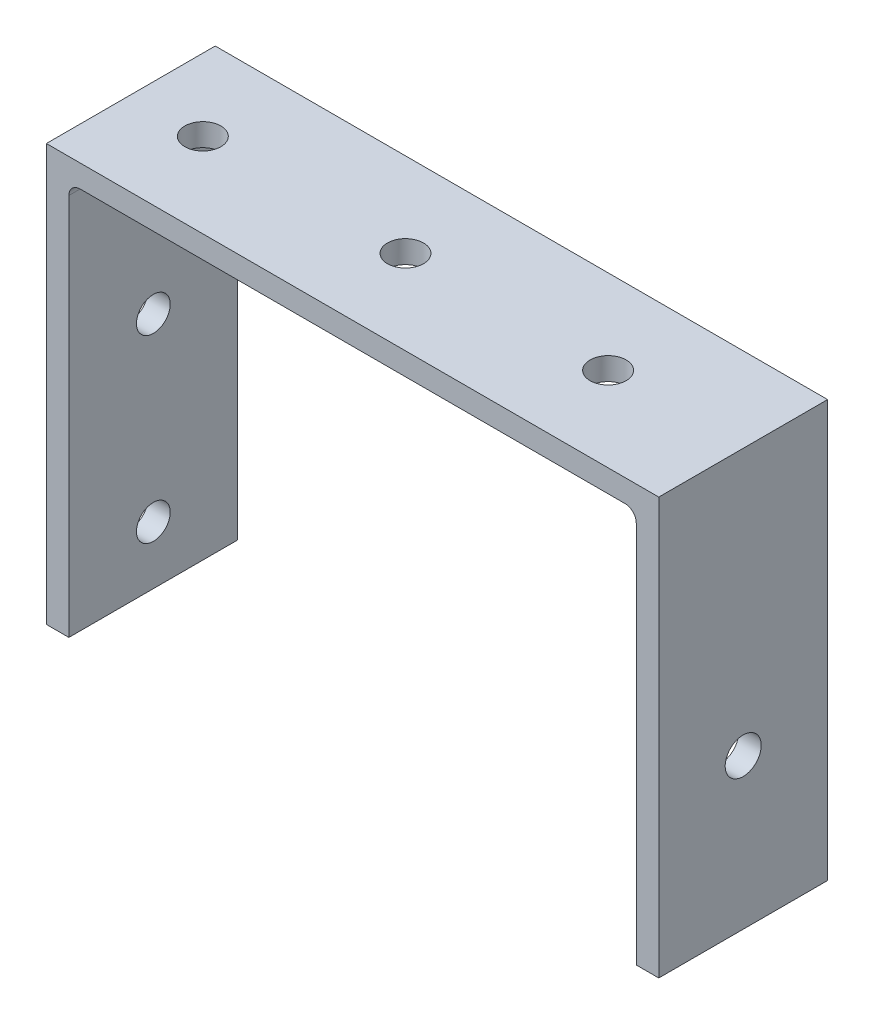
ISO-10303-21;
HEADER;
FILE_DESCRIPTION(('STEP AP214'),'2;1');
FILE_NAME('part.step','',(''),(''),'','','');
FILE_SCHEMA(('AUTOMOTIVE_DESIGN { 1 0 10303 214 1 1 1 1 }'));
ENDSEC;
DATA;
#1=APPLICATION_CONTEXT('core data for automotive mechanical design processes');
#2=APPLICATION_PROTOCOL_DEFINITION('international standard','automotive_design',2000,#1);
#3=PRODUCT_CONTEXT('',#1,'mechanical');
#4=PRODUCT('Part','Part','',(#3));
#5=PRODUCT_RELATED_PRODUCT_CATEGORY('part','',(#4));
#6=PRODUCT_DEFINITION_FORMATION('','',#4);
#7=PRODUCT_DEFINITION_CONTEXT('part definition',#1,'design');
#8=PRODUCT_DEFINITION('design','',#6,#7);
#9=PRODUCT_DEFINITION_SHAPE('','',#8);
#10=(LENGTH_UNIT() NAMED_UNIT(*) SI_UNIT(.MILLI.,.METRE.));
#11=(NAMED_UNIT(*) PLANE_ANGLE_UNIT() SI_UNIT($,.RADIAN.));
#12=(NAMED_UNIT(*) SI_UNIT($,.STERADIAN.) SOLID_ANGLE_UNIT());
#13=UNCERTAINTY_MEASURE_WITH_UNIT(LENGTH_MEASURE(1.E-05),#10,'distance_accuracy_value','');
#14=(GEOMETRIC_REPRESENTATION_CONTEXT(3) GLOBAL_UNCERTAINTY_ASSIGNED_CONTEXT((#13)) GLOBAL_UNIT_ASSIGNED_CONTEXT((#10,
#11,#12)) REPRESENTATION_CONTEXT('',''));
#15=CARTESIAN_POINT('',(0.,0.,0.));
#16=DIRECTION('',(0.,0.,1.));
#17=DIRECTION('',(1.,0.,0.));
#18=AXIS2_PLACEMENT_3D('',#15,#16,#17);
#19=CARTESIAN_POINT('',(0.,0.,0.));
#20=DIRECTION('',(0.,-1.,0.));
#21=DIRECTION('',(0.,0.,-1.));
#22=AXIS2_PLACEMENT_3D('',#19,#20,#21);
#23=PLANE('',#22);
#24=CARTESIAN_POINT('',(24.4,0.,-7.5));
#25=DIRECTION('',(0.,-1.,0.));
#26=DIRECTION('',(0.,0.,-1.));
#27=AXIS2_PLACEMENT_3D('',#24,#25,#26);
#28=CIRCLE('',#27,1.6);
#29=CARTESIAN_POINT('',(24.4,0.,-9.1));
#30=VERTEX_POINT('',#29);
#31=EDGE_CURVE('E284',#30,#30,#28,.F.);
#32=ORIENTED_EDGE('',*,*,#31,.T.);
#33=EDGE_LOOP('',(#32));
#34=FACE_BOUND('',#33,.T.);
#35=CARTESIAN_POINT('',(6.4,0.,-7.5));
#36=DIRECTION('',(0.,-1.,0.));
#37=DIRECTION('',(0.,0.,-1.));
#38=AXIS2_PLACEMENT_3D('',#35,#36,#37);
#39=CIRCLE('',#38,1.6);
#40=CARTESIAN_POINT('',(6.4,0.,-9.1));
#41=VERTEX_POINT('',#40);
#42=EDGE_CURVE('E278',#41,#41,#39,.F.);
#43=ORIENTED_EDGE('',*,*,#42,.T.);
#44=EDGE_LOOP('',(#43));
#45=FACE_BOUND('',#44,.T.);
#46=CARTESIAN_POINT('',(42.4,0.,-7.5));
#47=DIRECTION('',(0.,-1.,0.));
#48=DIRECTION('',(0.,0.,-1.));
#49=AXIS2_PLACEMENT_3D('',#46,#47,#48);
#50=CIRCLE('',#49,1.6);
#51=CARTESIAN_POINT('',(42.4,0.,-9.1));
#52=VERTEX_POINT('',#51);
#53=EDGE_CURVE('E272',#52,#52,#50,.F.);
#54=ORIENTED_EDGE('',*,*,#53,.T.);
#55=EDGE_LOOP('',(#54));
#56=FACE_BOUND('',#55,.T.);
#57=DIRECTION('',(-1.,0.,0.));
#58=VECTOR('',#57,1.);
#59=CARTESIAN_POINT('',(0.,0.,-15.));
#60=LINE('',#59,#58);
#61=CARTESIAN_POINT('',(51.4,0.,-15.));
#62=VERTEX_POINT('',#61);
#63=CARTESIAN_POINT('',(3.,0.,-15.));
#64=VERTEX_POINT('',#63);
#65=EDGE_CURVE('E167',#62,#64,#60,.T.);
#66=ORIENTED_EDGE('',*,*,#65,.F.);
#67=DIRECTION('',(0.,0.,-1.));
#68=VECTOR('',#67,1.);
#69=CARTESIAN_POINT('',(51.4,0.,0.));
#70=LINE('',#69,#68);
#71=CARTESIAN_POINT('',(51.4,0.,0.));
#72=VERTEX_POINT('',#71);
#73=EDGE_CURVE('E186',#62,#72,#70,.F.);
#74=ORIENTED_EDGE('',*,*,#73,.T.);
#75=DIRECTION('',(1.,0.,0.));
#76=VECTOR('',#75,1.);
#77=CARTESIAN_POINT('',(54.4,0.,0.));
#78=LINE('',#77,#76);
#79=CARTESIAN_POINT('',(3.,0.,0.));
#80=VERTEX_POINT('',#79);
#81=EDGE_CURVE('E178',#80,#72,#78,.T.);
#82=ORIENTED_EDGE('',*,*,#81,.F.);
#83=DIRECTION('',(0.,0.,1.));
#84=VECTOR('',#83,1.);
#85=CARTESIAN_POINT('',(3.,0.,0.));
#86=LINE('',#85,#84);
#87=EDGE_CURVE('E184',#80,#64,#86,.F.);
#88=ORIENTED_EDGE('',*,*,#87,.T.);
#89=EDGE_LOOP('',(#66,#74,#82,#88));
#90=FACE_BOUND('',#89,.T.);
#91=ADVANCED_FACE('F37',(#34,#45,#56,#90),#23,.T.);
#92=CARTESIAN_POINT('',(54.4,2.,0.));
#93=DIRECTION('',(0.,0.,-1.));
#94=DIRECTION('',(-1.,0.,0.));
#95=AXIS2_PLACEMENT_3D('',#92,#93,#94);
#96=PLANE('',#95);
#97=DIRECTION('',(0.,-1.,0.));
#98=VECTOR('',#97,1.);
#99=CARTESIAN_POINT('',(0.,2.,0.));
#100=LINE('',#99,#98);
#101=CARTESIAN_POINT('',(0.,2.,0.));
#102=VERTEX_POINT('',#101);
#103=CARTESIAN_POINT('',(0.,-35.,0.));
#104=VERTEX_POINT('',#103);
#105=EDGE_CURVE('E172',#102,#104,#100,.T.);
#106=ORIENTED_EDGE('',*,*,#105,.T.);
#107=DIRECTION('',(-1.,0.,0.));
#108=VECTOR('',#107,1.);
#109=CARTESIAN_POINT('',(0.,-35.,0.));
#110=LINE('',#109,#108);
#111=CARTESIAN_POINT('',(2.,-35.,0.));
#112=VERTEX_POINT('',#111);
#113=EDGE_CURVE('E159',#112,#104,#110,.T.);
#114=ORIENTED_EDGE('',*,*,#113,.F.);
#115=DIRECTION('',(0.,1.,0.));
#116=VECTOR('',#115,1.);
#117=CARTESIAN_POINT('',(2.,-35.,0.));
#118=LINE('',#117,#116);
#119=CARTESIAN_POINT('',(2.,-1.,0.));
#120=VERTEX_POINT('',#119);
#121=EDGE_CURVE('E162',#112,#120,#118,.T.);
#122=ORIENTED_EDGE('',*,*,#121,.T.);
#123=CARTESIAN_POINT('',(3.,-1.,0.));
#124=DIRECTION('',(0.,0.,-1.));
#125=DIRECTION('',(-1.,0.,0.));
#126=AXIS2_PLACEMENT_3D('',#123,#124,#125);
#127=CIRCLE('',#126,1.);
#128=EDGE_CURVE('E45',#120,#80,#127,.T.);
#129=ORIENTED_EDGE('',*,*,#128,.T.);
#130=ORIENTED_EDGE('',*,*,#81,.T.);
#131=CARTESIAN_POINT('',(51.4,-1.,0.));
#132=DIRECTION('',(0.,0.,-1.));
#133=DIRECTION('',(-1.,0.,0.));
#134=AXIS2_PLACEMENT_3D('',#131,#132,#133);
#135=CIRCLE('',#134,1.);
#136=CARTESIAN_POINT('',(52.4,-1.,0.));
#137=VERTEX_POINT('',#136);
#138=EDGE_CURVE('E193',#72,#137,#135,.T.);
#139=ORIENTED_EDGE('',*,*,#138,.T.);
#140=DIRECTION('',(0.,1.,0.));
#141=VECTOR('',#140,1.);
#142=CARTESIAN_POINT('',(52.4,-35.,0.));
#143=LINE('',#142,#141);
#144=CARTESIAN_POINT('',(52.4,-35.,0.));
#145=VERTEX_POINT('',#144);
#146=EDGE_CURVE('E149',#145,#137,#143,.T.);
#147=ORIENTED_EDGE('',*,*,#146,.F.);
#148=DIRECTION('',(-1.,0.,0.));
#149=VECTOR('',#148,1.);
#150=CARTESIAN_POINT('',(54.4,-35.,0.));
#151=LINE('',#150,#149);
#152=CARTESIAN_POINT('',(54.4,-35.,0.));
#153=VERTEX_POINT('',#152);
#154=EDGE_CURVE('E132',#153,#145,#151,.T.);
#155=ORIENTED_EDGE('',*,*,#154,.F.);
#156=DIRECTION('',(0.,-1.,0.));
#157=VECTOR('',#156,1.);
#158=CARTESIAN_POINT('',(54.4,2.,0.));
#159=LINE('',#158,#157);
#160=CARTESIAN_POINT('',(54.4,2.,0.));
#161=VERTEX_POINT('',#160);
#162=EDGE_CURVE('E123',#161,#153,#159,.T.);
#163=ORIENTED_EDGE('',*,*,#162,.F.);
#164=DIRECTION('',(1.,0.,0.));
#165=VECTOR('',#164,1.);
#166=CARTESIAN_POINT('',(54.4,2.,0.));
#167=LINE('',#166,#165);
#168=EDGE_CURVE('E163',#102,#161,#167,.T.);
#169=ORIENTED_EDGE('',*,*,#168,.F.);
#170=EDGE_LOOP('',(#106,#114,#122,#129,#130,#139,#147,#155,#163,#169));
#171=FACE_BOUND('',#170,.T.);
#172=ADVANCED_FACE('F197',(#171),#96,.F.);
#173=CARTESIAN_POINT('',(54.4,2.,-15.));
#174=DIRECTION('',(-1.,0.,0.));
#175=DIRECTION('',(0.,0.,1.));
#176=AXIS2_PLACEMENT_3D('',#173,#174,#175);
#177=PLANE('',#176);
#178=CARTESIAN_POINT('',(54.4,-21.65,-7.5));
#179=DIRECTION('',(1.,0.,0.));
#180=DIRECTION('',(0.,0.,-1.));
#181=AXIS2_PLACEMENT_3D('',#178,#179,#180);
#182=CIRCLE('',#181,1.6);
#183=CARTESIAN_POINT('',(54.4,-21.65,-9.1));
#184=VERTEX_POINT('',#183);
#185=EDGE_CURVE('E138',#184,#184,#182,.T.);
#186=ORIENTED_EDGE('',*,*,#185,.F.);
#187=EDGE_LOOP('',(#186));
#188=FACE_BOUND('',#187,.T.);
#189=ORIENTED_EDGE('',*,*,#162,.T.);
#190=DIRECTION('',(0.,0.,1.));
#191=VECTOR('',#190,1.);
#192=CARTESIAN_POINT('',(54.4,-35.,-15.));
#193=LINE('',#192,#191);
#194=CARTESIAN_POINT('',(54.4,-35.,-15.));
#195=VERTEX_POINT('',#194);
#196=EDGE_CURVE('E127',#195,#153,#193,.T.);
#197=ORIENTED_EDGE('',*,*,#196,.F.);
#198=DIRECTION('',(0.,-1.,0.));
#199=VECTOR('',#198,1.);
#200=CARTESIAN_POINT('',(54.4,2.,-15.));
#201=LINE('',#200,#199);
#202=CARTESIAN_POINT('',(54.4,2.,-15.));
#203=VERTEX_POINT('',#202);
#204=EDGE_CURVE('E114',#203,#195,#201,.T.);
#205=ORIENTED_EDGE('',*,*,#204,.F.);
#206=DIRECTION('',(0.,0.,-1.));
#207=VECTOR('',#206,1.);
#208=CARTESIAN_POINT('',(54.4,2.,-15.));
#209=LINE('',#208,#207);
#210=EDGE_CURVE('E166',#161,#203,#209,.T.);
#211=ORIENTED_EDGE('',*,*,#210,.F.);
#212=EDGE_LOOP('',(#189,#197,#205,#211));
#213=FACE_BOUND('',#212,.T.);
#214=ADVANCED_FACE('F128',(#188,#213),#177,.F.);
#215=CARTESIAN_POINT('',(0.,2.,-15.));
#216=DIRECTION('',(0.,0.,1.));
#217=DIRECTION('',(1.,0.,0.));
#218=AXIS2_PLACEMENT_3D('',#215,#216,#217);
#219=PLANE('',#218);
#220=ORIENTED_EDGE('',*,*,#204,.T.);
#221=DIRECTION('',(1.,0.,0.));
#222=VECTOR('',#221,1.);
#223=CARTESIAN_POINT('',(52.4,-35.,-15.));
#224=LINE('',#223,#222);
#225=CARTESIAN_POINT('',(52.4,-35.,-15.));
#226=VERTEX_POINT('',#225);
#227=EDGE_CURVE('E119',#226,#195,#224,.T.);
#228=ORIENTED_EDGE('',*,*,#227,.F.);
#229=DIRECTION('',(0.,1.,0.));
#230=VECTOR('',#229,1.);
#231=CARTESIAN_POINT('',(52.4,-35.,-15.));
#232=LINE('',#231,#230);
#233=CARTESIAN_POINT('',(52.4,-1.,-15.));
#234=VERTEX_POINT('',#233);
#235=EDGE_CURVE('E147',#226,#234,#232,.T.);
#236=ORIENTED_EDGE('',*,*,#235,.T.);
#237=CARTESIAN_POINT('',(51.4,-1.,-15.));
#238=DIRECTION('',(0.,0.,1.));
#239=DIRECTION('',(1.,0.,0.));
#240=AXIS2_PLACEMENT_3D('',#237,#238,#239);
#241=CIRCLE('',#240,1.);
#242=EDGE_CURVE('E191',#234,#62,#241,.T.);
#243=ORIENTED_EDGE('',*,*,#242,.T.);
#244=ORIENTED_EDGE('',*,*,#65,.T.);
#245=CARTESIAN_POINT('',(3.,-1.,-15.));
#246=DIRECTION('',(0.,0.,1.));
#247=DIRECTION('',(1.,0.,0.));
#248=AXIS2_PLACEMENT_3D('',#245,#246,#247);
#249=CIRCLE('',#248,1.);
#250=CARTESIAN_POINT('',(2.,-1.,-15.));
#251=VERTEX_POINT('',#250);
#252=EDGE_CURVE('E11',#64,#251,#249,.T.);
#253=ORIENTED_EDGE('',*,*,#252,.T.);
#254=DIRECTION('',(0.,1.,0.));
#255=VECTOR('',#254,1.);
#256=CARTESIAN_POINT('',(2.,-35.,-15.));
#257=LINE('',#256,#255);
#258=CARTESIAN_POINT('',(2.,-35.,-15.));
#259=VERTEX_POINT('',#258);
#260=EDGE_CURVE('E182',#259,#251,#257,.T.);
#261=ORIENTED_EDGE('',*,*,#260,.F.);
#262=DIRECTION('',(1.,0.,0.));
#263=VECTOR('',#262,1.);
#264=CARTESIAN_POINT('',(2.,-35.,-15.));
#265=LINE('',#264,#263);
#266=CARTESIAN_POINT('',(0.,-35.,-15.));
#267=VERTEX_POINT('',#266);
#268=EDGE_CURVE('E155',#267,#259,#265,.T.);
#269=ORIENTED_EDGE('',*,*,#268,.F.);
#270=DIRECTION('',(0.,-1.,0.));
#271=VECTOR('',#270,1.);
#272=CARTESIAN_POINT('',(0.,2.,-15.));
#273=LINE('',#272,#271);
#274=CARTESIAN_POINT('',(0.,2.,-15.));
#275=VERTEX_POINT('',#274);
#276=EDGE_CURVE('E124',#275,#267,#273,.T.);
#277=ORIENTED_EDGE('',*,*,#276,.F.);
#278=DIRECTION('',(-1.,0.,0.));
#279=VECTOR('',#278,1.);
#280=CARTESIAN_POINT('',(0.,2.,-15.));
#281=LINE('',#280,#279);
#282=EDGE_CURVE('E121',#203,#275,#281,.T.);
#283=ORIENTED_EDGE('',*,*,#282,.F.);
#284=EDGE_LOOP('',(#220,#228,#236,#243,#244,#253,#261,#269,#277,#283));
#285=FACE_BOUND('',#284,.T.);
#286=ADVANCED_FACE('F116',(#285),#219,.F.);
#287=CARTESIAN_POINT('',(0.,2.,0.));
#288=DIRECTION('',(1.,0.,0.));
#289=DIRECTION('',(0.,0.,-1.));
#290=AXIS2_PLACEMENT_3D('',#287,#288,#289);
#291=PLANE('',#290);
#292=CARTESIAN_POINT('',(0.,-29.86,-7.5));
#293=DIRECTION('',(-1.,0.,0.));
#294=DIRECTION('',(0.,0.,1.));
#295=AXIS2_PLACEMENT_3D('',#292,#293,#294);
#296=CIRCLE('',#295,1.5);
#297=CARTESIAN_POINT('',(0.,-29.86,-6.));
#298=VERTEX_POINT('',#297);
#299=EDGE_CURVE('E297',#298,#298,#296,.T.);
#300=ORIENTED_EDGE('',*,*,#299,.F.);
#301=EDGE_LOOP('',(#300));
#302=FACE_BOUND('',#301,.T.);
#303=CARTESIAN_POINT('',(0.,-13.86,-7.50000000000001));
#304=DIRECTION('',(-1.,0.,0.));
#305=DIRECTION('',(0.,0.,1.));
#306=AXIS2_PLACEMENT_3D('',#303,#304,#305);
#307=CIRCLE('',#306,1.5);
#308=CARTESIAN_POINT('',(0.,-13.86,-6.00000000000001));
#309=VERTEX_POINT('',#308);
#310=EDGE_CURVE('E291',#309,#309,#307,.T.);
#311=ORIENTED_EDGE('',*,*,#310,.F.);
#312=EDGE_LOOP('',(#311));
#313=FACE_BOUND('',#312,.T.);
#314=ORIENTED_EDGE('',*,*,#276,.T.);
#315=DIRECTION('',(0.,0.,-1.));
#316=VECTOR('',#315,1.);
#317=CARTESIAN_POINT('',(0.,-35.,-15.));
#318=LINE('',#317,#316);
#319=EDGE_CURVE('E152',#104,#267,#318,.T.);
#320=ORIENTED_EDGE('',*,*,#319,.F.);
#321=ORIENTED_EDGE('',*,*,#105,.F.);
#322=DIRECTION('',(0.,0.,1.));
#323=VECTOR('',#322,1.);
#324=CARTESIAN_POINT('',(0.,2.,0.));
#325=LINE('',#324,#323);
#326=EDGE_CURVE('E170',#275,#102,#325,.T.);
#327=ORIENTED_EDGE('',*,*,#326,.F.);
#328=EDGE_LOOP('',(#314,#320,#321,#327));
#329=FACE_BOUND('',#328,.T.);
#330=ADVANCED_FACE('F226',(#302,#313,#329),#291,.F.);
#331=CARTESIAN_POINT('',(0.,2.,0.));
#332=DIRECTION('',(0.,-1.,0.));
#333=DIRECTION('',(0.,0.,-1.));
#334=AXIS2_PLACEMENT_3D('',#331,#332,#333);
#335=PLANE('',#334);
#336=CARTESIAN_POINT('',(24.4,2.,-7.5));
#337=DIRECTION('',(0.,1.,0.));
#338=DIRECTION('',(0.,0.,1.));
#339=AXIS2_PLACEMENT_3D('',#336,#337,#338);
#340=CIRCLE('',#339,1.6);
#341=CARTESIAN_POINT('',(24.4,2.,-5.9));
#342=VERTEX_POINT('',#341);
#343=EDGE_CURVE('E281',#342,#342,#340,.T.);
#344=ORIENTED_EDGE('',*,*,#343,.F.);
#345=EDGE_LOOP('',(#344));
#346=FACE_BOUND('',#345,.T.);
#347=CARTESIAN_POINT('',(6.4,2.,-7.5));
#348=DIRECTION('',(0.,1.,0.));
#349=DIRECTION('',(0.,0.,1.));
#350=AXIS2_PLACEMENT_3D('',#347,#348,#349);
#351=CIRCLE('',#350,1.6);
#352=CARTESIAN_POINT('',(6.4,2.,-5.9));
#353=VERTEX_POINT('',#352);
#354=EDGE_CURVE('E276',#353,#353,#351,.T.);
#355=ORIENTED_EDGE('',*,*,#354,.F.);
#356=EDGE_LOOP('',(#355));
#357=FACE_BOUND('',#356,.T.);
#358=CARTESIAN_POINT('',(42.4,2.,-7.5));
#359=DIRECTION('',(0.,1.,0.));
#360=DIRECTION('',(0.,0.,1.));
#361=AXIS2_PLACEMENT_3D('',#358,#359,#360);
#362=CIRCLE('',#361,1.6);
#363=CARTESIAN_POINT('',(42.4,2.,-5.9));
#364=VERTEX_POINT('',#363);
#365=EDGE_CURVE('E270',#364,#364,#362,.T.);
#366=ORIENTED_EDGE('',*,*,#365,.F.);
#367=EDGE_LOOP('',(#366));
#368=FACE_BOUND('',#367,.T.);
#369=ORIENTED_EDGE('',*,*,#168,.T.);
#370=ORIENTED_EDGE('',*,*,#210,.T.);
#371=ORIENTED_EDGE('',*,*,#282,.T.);
#372=ORIENTED_EDGE('',*,*,#326,.T.);
#373=EDGE_LOOP('',(#369,#370,#371,#372));
#374=FACE_BOUND('',#373,.T.);
#375=ADVANCED_FACE('F228',(#346,#357,#368,#374),#335,.F.);
#376=CARTESIAN_POINT('',(2.,-35.,0.));
#377=DIRECTION('',(-1.,0.,0.));
#378=DIRECTION('',(0.,0.,1.));
#379=AXIS2_PLACEMENT_3D('',#376,#377,#378);
#380=PLANE('',#379);
#381=CARTESIAN_POINT('',(2.,-29.86,-7.5));
#382=DIRECTION('',(-1.,0.,0.));
#383=DIRECTION('',(0.,0.,1.));
#384=AXIS2_PLACEMENT_3D('',#381,#382,#383);
#385=CIRCLE('',#384,1.5);
#386=CARTESIAN_POINT('',(2.,-29.86,-6.));
#387=VERTEX_POINT('',#386);
#388=EDGE_CURVE('E294',#387,#387,#385,.F.);
#389=ORIENTED_EDGE('',*,*,#388,.F.);
#390=EDGE_LOOP('',(#389));
#391=FACE_BOUND('',#390,.T.);
#392=CARTESIAN_POINT('',(2.,-13.86,-7.50000000000001));
#393=DIRECTION('',(-1.,0.,0.));
#394=DIRECTION('',(0.,0.,1.));
#395=AXIS2_PLACEMENT_3D('',#392,#393,#394);
#396=CIRCLE('',#395,1.5);
#397=CARTESIAN_POINT('',(2.,-13.86,-6.00000000000001));
#398=VERTEX_POINT('',#397);
#399=EDGE_CURVE('E286',#398,#398,#396,.F.);
#400=ORIENTED_EDGE('',*,*,#399,.F.);
#401=EDGE_LOOP('',(#400));
#402=FACE_BOUND('',#401,.T.);
#403=ORIENTED_EDGE('',*,*,#260,.T.);
#404=DIRECTION('',(0.,0.,1.));
#405=VECTOR('',#404,1.);
#406=CARTESIAN_POINT('',(2.,-1.,0.));
#407=LINE('',#406,#405);
#408=EDGE_CURVE('E189',#251,#120,#407,.T.);
#409=ORIENTED_EDGE('',*,*,#408,.T.);
#410=ORIENTED_EDGE('',*,*,#121,.F.);
#411=DIRECTION('',(0.,0.,1.));
#412=VECTOR('',#411,1.);
#413=CARTESIAN_POINT('',(2.,-35.,0.));
#414=LINE('',#413,#412);
#415=EDGE_CURVE('E157',#259,#112,#414,.T.);
#416=ORIENTED_EDGE('',*,*,#415,.F.);
#417=EDGE_LOOP('',(#403,#409,#410,#416));
#418=FACE_BOUND('',#417,.T.);
#419=ADVANCED_FACE('F205',(#391,#402,#418),#380,.F.);
#420=CARTESIAN_POINT('',(0.,-35.,0.));
#421=DIRECTION('',(0.,1.,0.));
#422=DIRECTION('',(0.,0.,1.));
#423=AXIS2_PLACEMENT_3D('',#420,#421,#422);
#424=PLANE('',#423);
#425=ORIENTED_EDGE('',*,*,#319,.T.);
#426=ORIENTED_EDGE('',*,*,#268,.T.);
#427=ORIENTED_EDGE('',*,*,#415,.T.);
#428=ORIENTED_EDGE('',*,*,#113,.T.);
#429=EDGE_LOOP('',(#425,#426,#427,#428));
#430=FACE_BOUND('',#429,.T.);
#431=ADVANCED_FACE('F225',(#430),#424,.F.);
#432=CARTESIAN_POINT('',(52.4,-35.,0.));
#433=DIRECTION('',(1.,0.,0.));
#434=DIRECTION('',(0.,0.,-1.));
#435=AXIS2_PLACEMENT_3D('',#432,#433,#434);
#436=PLANE('',#435);
#437=CARTESIAN_POINT('',(52.4,-21.65,-7.5));
#438=DIRECTION('',(1.,0.,0.));
#439=DIRECTION('',(0.,0.,-1.));
#440=AXIS2_PLACEMENT_3D('',#437,#438,#439);
#441=CIRCLE('',#440,1.6);
#442=CARTESIAN_POINT('',(52.4,-21.65,-9.1));
#443=VERTEX_POINT('',#442);
#444=EDGE_CURVE('E141',#443,#443,#441,.F.);
#445=ORIENTED_EDGE('',*,*,#444,.F.);
#446=EDGE_LOOP('',(#445));
#447=FACE_BOUND('',#446,.T.);
#448=ORIENTED_EDGE('',*,*,#146,.T.);
#449=DIRECTION('',(0.,0.,-1.));
#450=VECTOR('',#449,1.);
#451=CARTESIAN_POINT('',(52.4,-1.,0.));
#452=LINE('',#451,#450);
#453=EDGE_CURVE('E187',#137,#234,#452,.T.);
#454=ORIENTED_EDGE('',*,*,#453,.T.);
#455=ORIENTED_EDGE('',*,*,#235,.F.);
#456=DIRECTION('',(0.,0.,-1.));
#457=VECTOR('',#456,1.);
#458=CARTESIAN_POINT('',(52.4,-35.,0.));
#459=LINE('',#458,#457);
#460=EDGE_CURVE('E136',#145,#226,#459,.T.);
#461=ORIENTED_EDGE('',*,*,#460,.F.);
#462=EDGE_LOOP('',(#448,#454,#455,#461));
#463=FACE_BOUND('',#462,.T.);
#464=ADVANCED_FACE('F230',(#447,#463),#436,.F.);
#465=CARTESIAN_POINT('',(0.,-35.,0.));
#466=DIRECTION('',(0.,-1.,0.));
#467=DIRECTION('',(0.,0.,-1.));
#468=AXIS2_PLACEMENT_3D('',#465,#466,#467);
#469=PLANE('',#468);
#470=ORIENTED_EDGE('',*,*,#227,.T.);
#471=ORIENTED_EDGE('',*,*,#196,.T.);
#472=ORIENTED_EDGE('',*,*,#154,.T.);
#473=ORIENTED_EDGE('',*,*,#460,.T.);
#474=EDGE_LOOP('',(#470,#471,#472,#473));
#475=FACE_BOUND('',#474,.T.);
#476=ADVANCED_FACE('F134',(#475),#469,.T.);
#477=CARTESIAN_POINT('',(51.4,-1.,0.));
#478=DIRECTION('',(0.,0.,-1.));
#479=DIRECTION('',(-1.,0.,0.));
#480=AXIS2_PLACEMENT_3D('',#477,#478,#479);
#481=CYLINDRICAL_SURFACE('',#480,1.);
#482=ORIENTED_EDGE('',*,*,#138,.F.);
#483=ORIENTED_EDGE('',*,*,#73,.F.);
#484=ORIENTED_EDGE('',*,*,#242,.F.);
#485=ORIENTED_EDGE('',*,*,#453,.F.);
#486=EDGE_LOOP('',(#482,#483,#484,#485));
#487=FACE_BOUND('',#486,.T.);
#488=ADVANCED_FACE('F232',(#487),#481,.F.);
#489=CARTESIAN_POINT('',(3.,-1.,0.));
#490=DIRECTION('',(0.,0.,1.));
#491=DIRECTION('',(1.,0.,0.));
#492=AXIS2_PLACEMENT_3D('',#489,#490,#491);
#493=CYLINDRICAL_SURFACE('',#492,1.);
#494=ORIENTED_EDGE('',*,*,#252,.F.);
#495=ORIENTED_EDGE('',*,*,#87,.F.);
#496=ORIENTED_EDGE('',*,*,#128,.F.);
#497=ORIENTED_EDGE('',*,*,#408,.F.);
#498=EDGE_LOOP('',(#494,#495,#496,#497));
#499=FACE_BOUND('',#498,.T.);
#500=ADVANCED_FACE('F39',(#499),#493,.F.);
#501=CARTESIAN_POINT('',(-0.001000000000001,-21.65,-7.5));
#502=DIRECTION('',(1.,0.,0.));
#503=DIRECTION('',(0.,0.,-1.));
#504=AXIS2_PLACEMENT_3D('',#501,#502,#503);
#505=CYLINDRICAL_SURFACE('',#504,1.6);
#506=ORIENTED_EDGE('',*,*,#185,.T.);
#507=EDGE_LOOP('',(#506));
#508=FACE_BOUND('',#507,.T.);
#509=ORIENTED_EDGE('',*,*,#444,.T.);
#510=EDGE_LOOP('',(#509));
#511=FACE_BOUND('',#510,.T.);
#512=ADVANCED_FACE('F238',(#508,#511),#505,.F.);
#513=CARTESIAN_POINT('',(42.4,-35.001,-7.5));
#514=DIRECTION('',(0.,1.,0.));
#515=DIRECTION('',(0.,0.,1.));
#516=AXIS2_PLACEMENT_3D('',#513,#514,#515);
#517=CYLINDRICAL_SURFACE('',#516,1.6);
#518=ORIENTED_EDGE('',*,*,#53,.F.);
#519=EDGE_LOOP('',(#518));
#520=FACE_BOUND('',#519,.T.);
#521=ORIENTED_EDGE('',*,*,#365,.T.);
#522=EDGE_LOOP('',(#521));
#523=FACE_BOUND('',#522,.T.);
#524=ADVANCED_FACE('F265',(#520,#523),#517,.F.);
#525=CARTESIAN_POINT('',(6.4,-35.001,-7.5));
#526=DIRECTION('',(0.,1.,0.));
#527=DIRECTION('',(0.,0.,1.));
#528=AXIS2_PLACEMENT_3D('',#525,#526,#527);
#529=CYLINDRICAL_SURFACE('',#528,1.6);
#530=ORIENTED_EDGE('',*,*,#42,.F.);
#531=EDGE_LOOP('',(#530));
#532=FACE_BOUND('',#531,.T.);
#533=ORIENTED_EDGE('',*,*,#354,.T.);
#534=EDGE_LOOP('',(#533));
#535=FACE_BOUND('',#534,.T.);
#536=ADVANCED_FACE('F327',(#532,#535),#529,.F.);
#537=CARTESIAN_POINT('',(24.4,-35.001,-7.5));
#538=DIRECTION('',(0.,1.,0.));
#539=DIRECTION('',(0.,0.,1.));
#540=AXIS2_PLACEMENT_3D('',#537,#538,#539);
#541=CYLINDRICAL_SURFACE('',#540,1.6);
#542=ORIENTED_EDGE('',*,*,#31,.F.);
#543=EDGE_LOOP('',(#542));
#544=FACE_BOUND('',#543,.T.);
#545=ORIENTED_EDGE('',*,*,#343,.T.);
#546=EDGE_LOOP('',(#545));
#547=FACE_BOUND('',#546,.T.);
#548=ADVANCED_FACE('F309',(#544,#547),#541,.F.);
#549=CARTESIAN_POINT('',(54.401,-13.86,-7.50000000000001));
#550=DIRECTION('',(-1.,0.,0.));
#551=DIRECTION('',(0.,0.,1.));
#552=AXIS2_PLACEMENT_3D('',#549,#550,#551);
#553=CYLINDRICAL_SURFACE('',#552,1.5);
#554=ORIENTED_EDGE('',*,*,#310,.T.);
#555=EDGE_LOOP('',(#554));
#556=FACE_BOUND('',#555,.T.);
#557=ORIENTED_EDGE('',*,*,#399,.T.);
#558=EDGE_LOOP('',(#557));
#559=FACE_BOUND('',#558,.T.);
#560=ADVANCED_FACE('F306',(#556,#559),#553,.F.);
#561=CARTESIAN_POINT('',(54.401,-29.86,-7.5));
#562=DIRECTION('',(-1.,0.,0.));
#563=DIRECTION('',(0.,0.,1.));
#564=AXIS2_PLACEMENT_3D('',#561,#562,#563);
#565=CYLINDRICAL_SURFACE('',#564,1.5);
#566=ORIENTED_EDGE('',*,*,#299,.T.);
#567=EDGE_LOOP('',(#566));
#568=FACE_BOUND('',#567,.T.);
#569=ORIENTED_EDGE('',*,*,#388,.T.);
#570=EDGE_LOOP('',(#569));
#571=FACE_BOUND('',#570,.T.);
#572=ADVANCED_FACE('F301',(#568,#571),#565,.F.);
#573=CLOSED_SHELL('',(#91,#172,#214,#286,#330,#375,#419,#431,#464,#476,#488,#500,#512,#524,#536,
#548,#560,#572));
#574=MANIFOLD_SOLID_BREP('B2',#573);
#575=ADVANCED_BREP_SHAPE_REPRESENTATION('',(#18,#574),#14);
#576=SHAPE_DEFINITION_REPRESENTATION(#9,#575);
ENDSEC;
END-ISO-10303-21;
